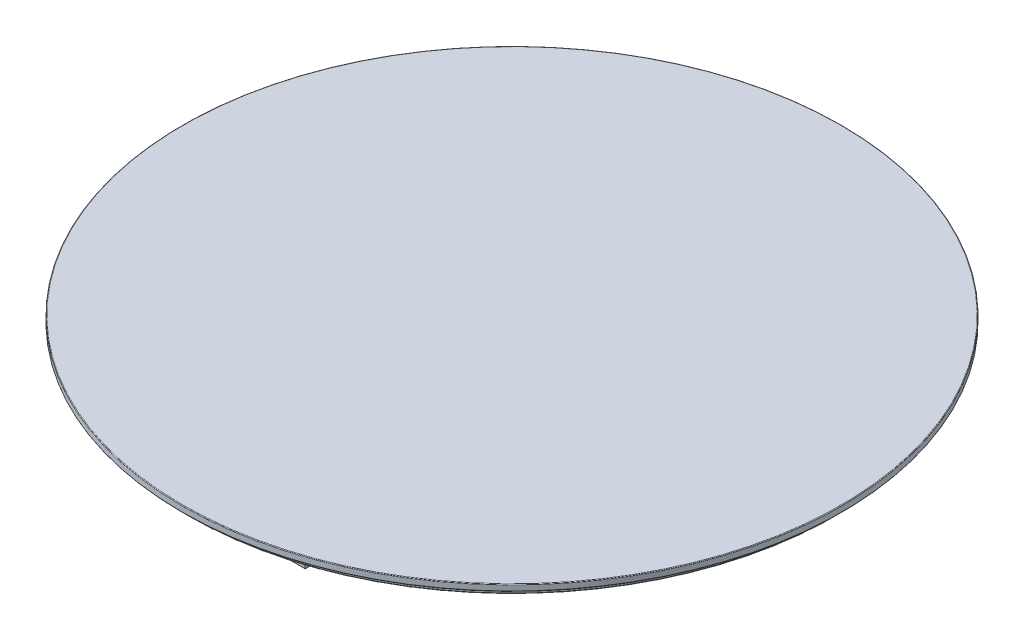
ISO-10303-21;
HEADER;
FILE_DESCRIPTION(('STEP AP214'),'2;1');
FILE_NAME('part.step','',(''),(''),'','','');
FILE_SCHEMA(('AUTOMOTIVE_DESIGN { 1 0 10303 214 1 1 1 1 }'));
ENDSEC;
DATA;
#1=APPLICATION_CONTEXT('core data for automotive mechanical design processes');
#2=APPLICATION_PROTOCOL_DEFINITION('international standard','automotive_design',2000,#1);
#3=PRODUCT_CONTEXT('',#1,'mechanical');
#4=PRODUCT('Part','Part','',(#3));
#5=PRODUCT_RELATED_PRODUCT_CATEGORY('part','',(#4));
#6=PRODUCT_DEFINITION_FORMATION('','',#4);
#7=PRODUCT_DEFINITION_CONTEXT('part definition',#1,'design');
#8=PRODUCT_DEFINITION('design','',#6,#7);
#9=PRODUCT_DEFINITION_SHAPE('','',#8);
#10=(LENGTH_UNIT() NAMED_UNIT(*) SI_UNIT(.MILLI.,.METRE.));
#11=(NAMED_UNIT(*) PLANE_ANGLE_UNIT() SI_UNIT($,.RADIAN.));
#12=(NAMED_UNIT(*) SI_UNIT($,.STERADIAN.) SOLID_ANGLE_UNIT());
#13=UNCERTAINTY_MEASURE_WITH_UNIT(LENGTH_MEASURE(1.E-05),#10,'distance_accuracy_value','');
#14=(GEOMETRIC_REPRESENTATION_CONTEXT(3) GLOBAL_UNCERTAINTY_ASSIGNED_CONTEXT((#13)) GLOBAL_UNIT_ASSIGNED_CONTEXT((#10,
#11,#12)) REPRESENTATION_CONTEXT('',''));
#15=CARTESIAN_POINT('',(0.,0.,0.));
#16=DIRECTION('',(0.,0.,1.));
#17=DIRECTION('',(1.,0.,0.));
#18=AXIS2_PLACEMENT_3D('',#15,#16,#17);
#19=CARTESIAN_POINT('',(0.,0.,0.));
#20=DIRECTION('',(0.,1.,0.));
#21=DIRECTION('',(0.,0.,1.));
#22=AXIS2_PLACEMENT_3D('',#19,#20,#21);
#23=PLANE('',#22);
#24=DIRECTION('',(-0.866025403784436,0.,-0.500000000000004));
#25=VECTOR('',#24,1.);
#26=CARTESIAN_POINT('',(-73.301270189222,0.,26.961524227066));
#27=LINE('',#26,#25);
#28=CARTESIAN_POINT('',(-73.301270189222,0.,26.961524227066));
#29=VERTEX_POINT('',#28);
#30=CARTESIAN_POINT('',(-220.525588832576,0.,-58.0384757729347));
#31=VERTEX_POINT('',#30);
#32=EDGE_CURVE('E334',#29,#31,#27,.T.);
#33=ORIENTED_EDGE('',*,*,#32,.F.);
#34=DIRECTION('',(-0.500000000000004,0.,0.866025403784437));
#35=VECTOR('',#34,1.);
#36=CARTESIAN_POINT('',(-13.3012701892216,0.,-76.9615242270664));
#37=LINE('',#36,#35);
#38=CARTESIAN_POINT('',(-13.3012701892216,0.,-76.9615242270664));
#39=VERTEX_POINT('',#38);
#40=EDGE_CURVE('E339',#39,#29,#37,.T.);
#41=ORIENTED_EDGE('',*,*,#40,.F.);
#42=DIRECTION('',(0.866025403784436,0.,0.500000000000004));
#43=VECTOR('',#42,1.);
#44=CARTESIAN_POINT('',(-13.3012701892216,0.,-76.9615242270664));
#45=LINE('',#44,#43);
#46=CARTESIAN_POINT('',(-160.525588832576,0.,-161.961524227067));
#47=VERTEX_POINT('',#46);
#48=EDGE_CURVE('E351',#47,#39,#45,.T.);
#49=ORIENTED_EDGE('',*,*,#48,.F.);
#50=DIRECTION('',(0.500000000000004,0.,-0.866025403784436));
#51=VECTOR('',#50,1.);
#52=CARTESIAN_POINT('',(-160.525588832576,0.,-161.961524227067));
#53=LINE('',#52,#51);
#54=EDGE_CURVE('E348',#31,#47,#53,.T.);
#55=ORIENTED_EDGE('',*,*,#54,.F.);
#56=EDGE_LOOP('',(#33,#41,#49,#55));
#57=FACE_BOUND('',#56,.T.);
#58=CARTESIAN_POINT('',(0.,0.,0.));
#59=DIRECTION('',(0.,1.,0.));
#60=DIRECTION('',(0.,0.,1.));
#61=AXIS2_PLACEMENT_3D('',#58,#59,#60);
#62=CIRCLE('',#61,249.5);
#63=CARTESIAN_POINT('',(0.,0.,249.5));
#64=VERTEX_POINT('',#63);
#65=EDGE_CURVE('E48',#64,#64,#62,.F.);
#66=ORIENTED_EDGE('',*,*,#65,.T.);
#67=EDGE_LOOP('',(#66));
#68=FACE_BOUND('',#67,.T.);
#69=DIRECTION('',(0.,0.,1.));
#70=VECTOR('',#69,1.);
#71=CARTESIAN_POINT('',(60.,0.,50.));
#72=LINE('',#71,#70);
#73=CARTESIAN_POINT('',(60.,0.,50.));
#74=VERTEX_POINT('',#73);
#75=CARTESIAN_POINT('',(60.,0.,220.));
#76=VERTEX_POINT('',#75);
#77=EDGE_CURVE('E367',#74,#76,#72,.T.);
#78=ORIENTED_EDGE('',*,*,#77,.F.);
#79=DIRECTION('',(1.,0.,0.));
#80=VECTOR('',#79,1.);
#81=CARTESIAN_POINT('',(-60.,0.,50.));
#82=LINE('',#81,#80);
#83=CARTESIAN_POINT('',(-60.,0.,50.));
#84=VERTEX_POINT('',#83);
#85=EDGE_CURVE('E372',#84,#74,#82,.T.);
#86=ORIENTED_EDGE('',*,*,#85,.F.);
#87=DIRECTION('',(0.,0.,-1.));
#88=VECTOR('',#87,1.);
#89=CARTESIAN_POINT('',(-60.,0.,50.));
#90=LINE('',#89,#88);
#91=CARTESIAN_POINT('',(-60.,0.,220.));
#92=VERTEX_POINT('',#91);
#93=EDGE_CURVE('E384',#92,#84,#90,.T.);
#94=ORIENTED_EDGE('',*,*,#93,.F.);
#95=DIRECTION('',(-1.,0.,0.));
#96=VECTOR('',#95,1.);
#97=CARTESIAN_POINT('',(-60.,0.,220.));
#98=LINE('',#97,#96);
#99=EDGE_CURVE('E381',#76,#92,#98,.T.);
#100=ORIENTED_EDGE('',*,*,#99,.F.);
#101=EDGE_LOOP('',(#78,#86,#94,#100));
#102=FACE_BOUND('',#101,.T.);
#103=DIRECTION('',(0.866025403784443,0.,-0.499999999999992));
#104=VECTOR('',#103,1.);
#105=CARTESIAN_POINT('',(13.3012701892226,0.,-76.9615242270662));
#106=LINE('',#105,#104);
#107=CARTESIAN_POINT('',(13.3012701892226,0.,-76.9615242270662));
#108=VERTEX_POINT('',#107);
#109=CARTESIAN_POINT('',(160.525588832578,0.,-161.961524227065));
#110=VERTEX_POINT('',#109);
#111=EDGE_CURVE('E295',#108,#110,#106,.T.);
#112=ORIENTED_EDGE('',*,*,#111,.F.);
#113=DIRECTION('',(-0.499999999999992,0.,-0.866025403784443));
#114=VECTOR('',#113,1.);
#115=CARTESIAN_POINT('',(73.3012701892217,0.,26.961524227067));
#116=LINE('',#115,#114);
#117=CARTESIAN_POINT('',(73.3012701892217,0.,26.961524227067));
#118=VERTEX_POINT('',#117);
#119=EDGE_CURVE('E306',#118,#108,#116,.T.);
#120=ORIENTED_EDGE('',*,*,#119,.F.);
#121=DIRECTION('',(-0.866025403784443,0.,0.499999999999992));
#122=VECTOR('',#121,1.);
#123=CARTESIAN_POINT('',(73.3012701892217,0.,26.961524227067));
#124=LINE('',#123,#122);
#125=CARTESIAN_POINT('',(220.525588832577,0.,-58.0384757729316));
#126=VERTEX_POINT('',#125);
#127=EDGE_CURVE('E318',#126,#118,#124,.T.);
#128=ORIENTED_EDGE('',*,*,#127,.F.);
#129=DIRECTION('',(0.499999999999992,0.,0.866025403784443));
#130=VECTOR('',#129,1.);
#131=CARTESIAN_POINT('',(220.525588832577,0.,-58.0384757729316));
#132=LINE('',#131,#130);
#133=EDGE_CURVE('E315',#110,#126,#132,.T.);
#134=ORIENTED_EDGE('',*,*,#133,.F.);
#135=EDGE_LOOP('',(#112,#120,#128,#134));
#136=FACE_BOUND('',#135,.T.);
#137=ADVANCED_FACE('F40',(#57,#68,#102,#136),#23,.F.);
#138=CARTESIAN_POINT('',(0.,10.,0.));
#139=DIRECTION('',(0.,-1.,0.));
#140=DIRECTION('',(0.,0.,-1.));
#141=AXIS2_PLACEMENT_3D('',#138,#139,#140);
#142=CYLINDRICAL_SURFACE('',#141,255.);
#143=CARTESIAN_POINT('',(0.,9.5,0.));
#144=DIRECTION('',(0.,1.,0.));
#145=DIRECTION('',(0.,0.,1.));
#146=AXIS2_PLACEMENT_3D('',#143,#144,#145);
#147=CIRCLE('',#146,255.);
#148=CARTESIAN_POINT('',(0.,9.5,255.));
#149=VERTEX_POINT('',#148);
#150=EDGE_CURVE('E409',#149,#149,#147,.F.);
#151=ORIENTED_EDGE('',*,*,#150,.T.);
#152=EDGE_LOOP('',(#151));
#153=FACE_BOUND('',#152,.T.);
#154=CARTESIAN_POINT('',(0.,5.5,0.));
#155=DIRECTION('',(0.,-1.,0.));
#156=DIRECTION('',(0.,0.,-1.));
#157=AXIS2_PLACEMENT_3D('',#154,#155,#156);
#158=CIRCLE('',#157,255.);
#159=CARTESIAN_POINT('',(0.,5.5,-255.));
#160=VERTEX_POINT('',#159);
#161=EDGE_CURVE('E406',#160,#160,#158,.F.);
#162=ORIENTED_EDGE('',*,*,#161,.T.);
#163=EDGE_LOOP('',(#162));
#164=FACE_BOUND('',#163,.T.);
#165=ADVANCED_FACE('F434',(#153,#164),#142,.T.);
#166=CARTESIAN_POINT('',(0.,10.,0.));
#167=DIRECTION('',(0.,1.,0.));
#168=DIRECTION('',(0.,0.,1.));
#169=AXIS2_PLACEMENT_3D('',#166,#167,#168);
#170=PLANE('',#169);
#171=CARTESIAN_POINT('',(0.,10.,0.));
#172=DIRECTION('',(0.,1.,0.));
#173=DIRECTION('',(0.,0.,1.));
#174=AXIS2_PLACEMENT_3D('',#171,#172,#173);
#175=CIRCLE('',#174,254.5);
#176=CARTESIAN_POINT('',(0.,10.,254.5));
#177=VERTEX_POINT('',#176);
#178=EDGE_CURVE('E403',#177,#177,#175,.T.);
#179=ORIENTED_EDGE('',*,*,#178,.T.);
#180=EDGE_LOOP('',(#179));
#181=FACE_BOUND('',#180,.T.);
#182=ADVANCED_FACE('F440',(#181),#170,.T.);
#183=CARTESIAN_POINT('',(0.,5.,0.));
#184=DIRECTION('',(0.,-1.,0.));
#185=DIRECTION('',(0.,0.,-1.));
#186=AXIS2_PLACEMENT_3D('',#183,#184,#185);
#187=CYLINDRICAL_SURFACE('',#186,250.);
#188=CARTESIAN_POINT('',(0.,0.5,0.));
#189=DIRECTION('',(0.,1.,0.));
#190=DIRECTION('',(0.,0.,1.));
#191=AXIS2_PLACEMENT_3D('',#188,#189,#190);
#192=CIRCLE('',#191,250.);
#193=CARTESIAN_POINT('',(0.,0.5,250.));
#194=VERTEX_POINT('',#193);
#195=EDGE_CURVE('E11',#194,#194,#192,.T.);
#196=ORIENTED_EDGE('',*,*,#195,.T.);
#197=EDGE_LOOP('',(#196));
#198=FACE_BOUND('',#197,.T.);
#199=CARTESIAN_POINT('',(0.,5.,0.));
#200=DIRECTION('',(0.,-1.,0.));
#201=DIRECTION('',(0.,0.,-1.));
#202=AXIS2_PLACEMENT_3D('',#199,#200,#201);
#203=CIRCLE('',#202,250.);
#204=CARTESIAN_POINT('',(0.,5.,-250.));
#205=VERTEX_POINT('',#204);
#206=EDGE_CURVE('E400',#205,#205,#203,.T.);
#207=ORIENTED_EDGE('',*,*,#206,.T.);
#208=EDGE_LOOP('',(#207));
#209=FACE_BOUND('',#208,.T.);
#210=ADVANCED_FACE('F452',(#198,#209),#187,.T.);
#211=CARTESIAN_POINT('',(0.,5.,0.));
#212=DIRECTION('',(0.,-1.,0.));
#213=DIRECTION('',(0.,0.,-1.));
#214=AXIS2_PLACEMENT_3D('',#211,#212,#213);
#215=PLANE('',#214);
#216=CARTESIAN_POINT('',(0.,5.,0.));
#217=DIRECTION('',(0.,-1.,0.));
#218=DIRECTION('',(0.,0.,-1.));
#219=AXIS2_PLACEMENT_3D('',#216,#217,#218);
#220=CIRCLE('',#219,254.5);
#221=CARTESIAN_POINT('',(0.,5.,-254.5));
#222=VERTEX_POINT('',#221);
#223=EDGE_CURVE('E412',#222,#222,#220,.T.);
#224=ORIENTED_EDGE('',*,*,#223,.T.);
#225=EDGE_LOOP('',(#224));
#226=FACE_BOUND('',#225,.T.);
#227=ORIENTED_EDGE('',*,*,#206,.F.);
#228=EDGE_LOOP('',(#227));
#229=FACE_BOUND('',#228,.T.);
#230=ADVANCED_FACE('F447',(#226,#229),#215,.T.);
#231=CARTESIAN_POINT('',(0.,9.5,0.));
#232=DIRECTION('',(0.,1.,0.));
#233=DIRECTION('',(0.,0.,1.));
#234=AXIS2_PLACEMENT_3D('',#231,#232,#233);
#235=TOROIDAL_SURFACE('',#234,254.5,0.5);
#236=ORIENTED_EDGE('',*,*,#150,.F.);
#237=EDGE_LOOP('',(#236));
#238=FACE_BOUND('',#237,.T.);
#239=ORIENTED_EDGE('',*,*,#178,.F.);
#240=EDGE_LOOP('',(#239));
#241=FACE_BOUND('',#240,.T.);
#242=ADVANCED_FACE('F430',(#238,#241),#235,.T.);
#243=CARTESIAN_POINT('',(0.,5.5,0.));
#244=DIRECTION('',(0.,-1.,0.));
#245=DIRECTION('',(0.,0.,-1.));
#246=AXIS2_PLACEMENT_3D('',#243,#244,#245);
#247=TOROIDAL_SURFACE('',#246,254.5,0.5);
#248=ORIENTED_EDGE('',*,*,#161,.F.);
#249=EDGE_LOOP('',(#248));
#250=FACE_BOUND('',#249,.T.);
#251=ORIENTED_EDGE('',*,*,#223,.F.);
#252=EDGE_LOOP('',(#251));
#253=FACE_BOUND('',#252,.T.);
#254=ADVANCED_FACE('F421',(#250,#253),#247,.T.);
#255=CARTESIAN_POINT('',(0.,0.5,0.));
#256=DIRECTION('',(0.,1.,0.));
#257=DIRECTION('',(0.,0.,1.));
#258=AXIS2_PLACEMENT_3D('',#255,#256,#257);
#259=TOROIDAL_SURFACE('',#258,249.5,0.5);
#260=ORIENTED_EDGE('',*,*,#195,.F.);
#261=EDGE_LOOP('',(#260));
#262=FACE_BOUND('',#261,.T.);
#263=ORIENTED_EDGE('',*,*,#65,.F.);
#264=EDGE_LOOP('',(#263));
#265=FACE_BOUND('',#264,.T.);
#266=ADVANCED_FACE('F42',(#262,#265),#259,.T.);
#267=CARTESIAN_POINT('',(60.,-20.,50.));
#268=DIRECTION('',(-1.,0.,0.));
#269=DIRECTION('',(0.,0.,1.));
#270=AXIS2_PLACEMENT_3D('',#267,#268,#269);
#271=PLANE('',#270);
#272=ORIENTED_EDGE('',*,*,#77,.T.);
#273=DIRECTION('',(0.,1.,0.));
#274=VECTOR('',#273,1.);
#275=CARTESIAN_POINT('',(60.,-20.,220.));
#276=LINE('',#275,#274);
#277=CARTESIAN_POINT('',(60.,-20.,220.));
#278=VERTEX_POINT('',#277);
#279=EDGE_CURVE('E397',#278,#76,#276,.T.);
#280=ORIENTED_EDGE('',*,*,#279,.F.);
#281=DIRECTION('',(0.,0.,1.));
#282=VECTOR('',#281,1.);
#283=CARTESIAN_POINT('',(60.,-20.,50.));
#284=LINE('',#283,#282);
#285=CARTESIAN_POINT('',(60.,-20.,50.));
#286=VERTEX_POINT('',#285);
#287=EDGE_CURVE('E368',#286,#278,#284,.T.);
#288=ORIENTED_EDGE('',*,*,#287,.F.);
#289=DIRECTION('',(0.,1.,0.));
#290=VECTOR('',#289,1.);
#291=CARTESIAN_POINT('',(60.,-20.,50.));
#292=LINE('',#291,#290);
#293=EDGE_CURVE('E378',#286,#74,#292,.T.);
#294=ORIENTED_EDGE('',*,*,#293,.T.);
#295=EDGE_LOOP('',(#272,#280,#288,#294));
#296=FACE_BOUND('',#295,.T.);
#297=ADVANCED_FACE('F420',(#296),#271,.F.);
#298=CARTESIAN_POINT('',(-60.,-20.,220.));
#299=DIRECTION('',(0.,0.,-1.));
#300=DIRECTION('',(-1.,0.,0.));
#301=AXIS2_PLACEMENT_3D('',#298,#299,#300);
#302=PLANE('',#301);
#303=ORIENTED_EDGE('',*,*,#99,.T.);
#304=DIRECTION('',(0.,1.,0.));
#305=VECTOR('',#304,1.);
#306=CARTESIAN_POINT('',(-60.,-20.,220.));
#307=LINE('',#306,#305);
#308=CARTESIAN_POINT('',(-60.,-20.,220.));
#309=VERTEX_POINT('',#308);
#310=EDGE_CURVE('E394',#309,#92,#307,.T.);
#311=ORIENTED_EDGE('',*,*,#310,.F.);
#312=DIRECTION('',(-1.,0.,0.));
#313=VECTOR('',#312,1.);
#314=CARTESIAN_POINT('',(-60.,-20.,220.));
#315=LINE('',#314,#313);
#316=EDGE_CURVE('E371',#278,#309,#315,.T.);
#317=ORIENTED_EDGE('',*,*,#316,.F.);
#318=ORIENTED_EDGE('',*,*,#279,.T.);
#319=EDGE_LOOP('',(#303,#311,#317,#318));
#320=FACE_BOUND('',#319,.T.);
#321=ADVANCED_FACE('F427',(#320),#302,.F.);
#322=CARTESIAN_POINT('',(-60.,-20.,50.));
#323=DIRECTION('',(1.,0.,0.));
#324=DIRECTION('',(0.,0.,-1.));
#325=AXIS2_PLACEMENT_3D('',#322,#323,#324);
#326=PLANE('',#325);
#327=ORIENTED_EDGE('',*,*,#93,.T.);
#328=DIRECTION('',(0.,1.,0.));
#329=VECTOR('',#328,1.);
#330=CARTESIAN_POINT('',(-60.,-20.,50.));
#331=LINE('',#330,#329);
#332=CARTESIAN_POINT('',(-60.,-20.,50.));
#333=VERTEX_POINT('',#332);
#334=EDGE_CURVE('E391',#333,#84,#331,.T.);
#335=ORIENTED_EDGE('',*,*,#334,.F.);
#336=DIRECTION('',(0.,0.,-1.));
#337=VECTOR('',#336,1.);
#338=CARTESIAN_POINT('',(-60.,-20.,50.));
#339=LINE('',#338,#337);
#340=EDGE_CURVE('E374',#309,#333,#339,.T.);
#341=ORIENTED_EDGE('',*,*,#340,.F.);
#342=ORIENTED_EDGE('',*,*,#310,.T.);
#343=EDGE_LOOP('',(#327,#335,#341,#342));
#344=FACE_BOUND('',#343,.T.);
#345=ADVANCED_FACE('F470',(#344),#326,.F.);
#346=CARTESIAN_POINT('',(-60.,-20.,50.));
#347=DIRECTION('',(0.,0.,1.));
#348=DIRECTION('',(1.,0.,0.));
#349=AXIS2_PLACEMENT_3D('',#346,#347,#348);
#350=PLANE('',#349);
#351=ORIENTED_EDGE('',*,*,#85,.T.);
#352=ORIENTED_EDGE('',*,*,#293,.F.);
#353=DIRECTION('',(1.,0.,0.));
#354=VECTOR('',#353,1.);
#355=CARTESIAN_POINT('',(-60.,-20.,50.));
#356=LINE('',#355,#354);
#357=EDGE_CURVE('E376',#333,#286,#356,.T.);
#358=ORIENTED_EDGE('',*,*,#357,.F.);
#359=ORIENTED_EDGE('',*,*,#334,.T.);
#360=EDGE_LOOP('',(#351,#352,#358,#359));
#361=FACE_BOUND('',#360,.T.);
#362=ADVANCED_FACE('F474',(#361),#350,.F.);
#363=CARTESIAN_POINT('',(0.,-20.,0.));
#364=DIRECTION('',(0.,1.,0.));
#365=DIRECTION('',(0.,0.,1.));
#366=AXIS2_PLACEMENT_3D('',#363,#364,#365);
#367=PLANE('',#366);
#368=DIRECTION('',(1.,0.,0.));
#369=VECTOR('',#368,1.);
#370=CARTESIAN_POINT('',(-55.,-20.,55.));
#371=LINE('',#370,#369);
#372=CARTESIAN_POINT('',(-55.,-20.,55.));
#373=VERTEX_POINT('',#372);
#374=CARTESIAN_POINT('',(55.,-20.,55.));
#375=VERTEX_POINT('',#374);
#376=EDGE_CURVE('E285',#373,#375,#371,.T.);
#377=ORIENTED_EDGE('',*,*,#376,.F.);
#378=DIRECTION('',(0.,0.,-1.));
#379=VECTOR('',#378,1.);
#380=CARTESIAN_POINT('',(-55.,-20.,215.));
#381=LINE('',#380,#379);
#382=CARTESIAN_POINT('',(-55.,-20.,215.));
#383=VERTEX_POINT('',#382);
#384=EDGE_CURVE('E237',#383,#373,#381,.T.);
#385=ORIENTED_EDGE('',*,*,#384,.F.);
#386=DIRECTION('',(-1.,0.,0.));
#387=VECTOR('',#386,1.);
#388=CARTESIAN_POINT('',(55.,-20.,215.));
#389=LINE('',#388,#387);
#390=CARTESIAN_POINT('',(55.,-20.,215.));
#391=VERTEX_POINT('',#390);
#392=EDGE_CURVE('E274',#391,#383,#389,.T.);
#393=ORIENTED_EDGE('',*,*,#392,.F.);
#394=DIRECTION('',(0.,0.,1.));
#395=VECTOR('',#394,1.);
#396=CARTESIAN_POINT('',(55.,-20.,55.));
#397=LINE('',#396,#395);
#398=EDGE_CURVE('E288',#375,#391,#397,.T.);
#399=ORIENTED_EDGE('',*,*,#398,.F.);
#400=EDGE_LOOP('',(#377,#385,#393,#399));
#401=FACE_BOUND('',#400,.T.);
#402=ORIENTED_EDGE('',*,*,#287,.T.);
#403=ORIENTED_EDGE('',*,*,#316,.T.);
#404=ORIENTED_EDGE('',*,*,#340,.T.);
#405=ORIENTED_EDGE('',*,*,#357,.T.);
#406=EDGE_LOOP('',(#402,#403,#404,#405));
#407=FACE_BOUND('',#406,.T.);
#408=ADVANCED_FACE('F478',(#401,#407),#367,.F.);
#409=CARTESIAN_POINT('',(-73.301270189222,-20.,26.961524227066));
#410=DIRECTION('',(0.500000000000004,0.,-0.866025403784436));
#411=DIRECTION('',(-0.866025403784436,0.,-0.500000000000004));
#412=AXIS2_PLACEMENT_3D('',#409,#410,#411);
#413=PLANE('',#412);
#414=ORIENTED_EDGE('',*,*,#32,.T.);
#415=DIRECTION('',(0.,1.,0.));
#416=VECTOR('',#415,1.);
#417=CARTESIAN_POINT('',(-220.525588832576,-20.,-58.0384757729348));
#418=LINE('',#417,#416);
#419=CARTESIAN_POINT('',(-220.525588832576,-20.,-58.0384757729348));
#420=VERTEX_POINT('',#419);
#421=EDGE_CURVE('E364',#420,#31,#418,.T.);
#422=ORIENTED_EDGE('',*,*,#421,.F.);
#423=DIRECTION('',(-0.866025403784436,0.,-0.500000000000004));
#424=VECTOR('',#423,1.);
#425=CARTESIAN_POINT('',(-73.301270189222,-20.,26.961524227066));
#426=LINE('',#425,#424);
#427=CARTESIAN_POINT('',(-73.301270189222,-20.,26.961524227066));
#428=VERTEX_POINT('',#427);
#429=EDGE_CURVE('E335',#428,#420,#426,.T.);
#430=ORIENTED_EDGE('',*,*,#429,.F.);
#431=DIRECTION('',(0.,1.,0.));
#432=VECTOR('',#431,1.);
#433=CARTESIAN_POINT('',(-73.301270189222,-20.,26.961524227066));
#434=LINE('',#433,#432);
#435=EDGE_CURVE('E345',#428,#29,#434,.T.);
#436=ORIENTED_EDGE('',*,*,#435,.T.);
#437=EDGE_LOOP('',(#414,#422,#430,#436));
#438=FACE_BOUND('',#437,.T.);
#439=ADVANCED_FACE('F482',(#438),#413,.F.);
#440=CARTESIAN_POINT('',(-160.525588832576,-20.,-161.961524227067));
#441=DIRECTION('',(0.866025403784436,0.,0.500000000000004));
#442=DIRECTION('',(0.500000000000004,0.,-0.866025403784436));
#443=AXIS2_PLACEMENT_3D('',#440,#441,#442);
#444=PLANE('',#443);
#445=ORIENTED_EDGE('',*,*,#54,.T.);
#446=DIRECTION('',(0.,1.,0.));
#447=VECTOR('',#446,1.);
#448=CARTESIAN_POINT('',(-160.525588832576,-20.,-161.961524227067));
#449=LINE('',#448,#447);
#450=CARTESIAN_POINT('',(-160.525588832576,-20.,-161.961524227067));
#451=VERTEX_POINT('',#450);
#452=EDGE_CURVE('E361',#451,#47,#449,.T.);
#453=ORIENTED_EDGE('',*,*,#452,.F.);
#454=DIRECTION('',(0.500000000000004,0.,-0.866025403784436));
#455=VECTOR('',#454,1.);
#456=CARTESIAN_POINT('',(-160.525588832576,-20.,-161.961524227067));
#457=LINE('',#456,#455);
#458=EDGE_CURVE('E338',#420,#451,#457,.T.);
#459=ORIENTED_EDGE('',*,*,#458,.F.);
#460=ORIENTED_EDGE('',*,*,#421,.T.);
#461=EDGE_LOOP('',(#445,#453,#459,#460));
#462=FACE_BOUND('',#461,.T.);
#463=ADVANCED_FACE('F486',(#462),#444,.F.);
#464=CARTESIAN_POINT('',(-13.3012701892216,-20.,-76.9615242270664));
#465=DIRECTION('',(-0.500000000000004,0.,0.866025403784436));
#466=DIRECTION('',(0.866025403784436,0.,0.500000000000004));
#467=AXIS2_PLACEMENT_3D('',#464,#465,#466);
#468=PLANE('',#467);
#469=ORIENTED_EDGE('',*,*,#48,.T.);
#470=DIRECTION('',(0.,1.,0.));
#471=VECTOR('',#470,1.);
#472=CARTESIAN_POINT('',(-13.3012701892216,-20.,-76.9615242270664));
#473=LINE('',#472,#471);
#474=CARTESIAN_POINT('',(-13.3012701892216,-20.,-76.9615242270664));
#475=VERTEX_POINT('',#474);
#476=EDGE_CURVE('E358',#475,#39,#473,.T.);
#477=ORIENTED_EDGE('',*,*,#476,.F.);
#478=DIRECTION('',(0.866025403784436,0.,0.500000000000004));
#479=VECTOR('',#478,1.);
#480=CARTESIAN_POINT('',(-13.3012701892216,-20.,-76.9615242270664));
#481=LINE('',#480,#479);
#482=EDGE_CURVE('E341',#451,#475,#481,.T.);
#483=ORIENTED_EDGE('',*,*,#482,.F.);
#484=ORIENTED_EDGE('',*,*,#452,.T.);
#485=EDGE_LOOP('',(#469,#477,#483,#484));
#486=FACE_BOUND('',#485,.T.);
#487=ADVANCED_FACE('F490',(#486),#468,.F.);
#488=CARTESIAN_POINT('',(-13.3012701892216,-20.,-76.9615242270664));
#489=DIRECTION('',(-0.866025403784436,0.,-0.500000000000004));
#490=DIRECTION('',(-0.500000000000004,0.,0.866025403784436));
#491=AXIS2_PLACEMENT_3D('',#488,#489,#490);
#492=PLANE('',#491);
#493=ORIENTED_EDGE('',*,*,#40,.T.);
#494=ORIENTED_EDGE('',*,*,#435,.F.);
#495=DIRECTION('',(-0.500000000000004,0.,0.866025403784437));
#496=VECTOR('',#495,1.);
#497=CARTESIAN_POINT('',(-13.3012701892216,-20.,-76.9615242270664));
#498=LINE('',#497,#496);
#499=EDGE_CURVE('E343',#475,#428,#498,.T.);
#500=ORIENTED_EDGE('',*,*,#499,.F.);
#501=ORIENTED_EDGE('',*,*,#476,.T.);
#502=EDGE_LOOP('',(#493,#494,#500,#501));
#503=FACE_BOUND('',#502,.T.);
#504=ADVANCED_FACE('F494',(#503),#492,.F.);
#505=CARTESIAN_POINT('',(0.,-20.,0.));
#506=DIRECTION('',(0.,1.,0.));
#507=DIRECTION('',(-0.866025403784436,0.,-0.500000000000004));
#508=AXIS2_PLACEMENT_3D('',#505,#506,#507);
#509=PLANE('',#508);
#510=DIRECTION('',(-0.499999999999992,0.,0.866025403784443));
#511=VECTOR('',#510,1.);
#512=CARTESIAN_POINT('',(-20.1313972081448,-20.,-75.131397208144));
#513=LINE('',#512,#511);
#514=CARTESIAN_POINT('',(-20.1313972081448,-20.,-75.131397208144));
#515=VERTEX_POINT('',#514);
#516=CARTESIAN_POINT('',(-75.1313972081439,-20.,20.1313972081448));
#517=VERTEX_POINT('',#516);
#518=EDGE_CURVE('E256',#515,#517,#513,.T.);
#519=ORIENTED_EDGE('',*,*,#518,.F.);
#520=DIRECTION('',(0.866025403784443,0.,0.499999999999992));
#521=VECTOR('',#520,1.);
#522=CARTESIAN_POINT('',(-158.695461813656,-20.,-155.131397208143));
#523=LINE('',#522,#521);
#524=CARTESIAN_POINT('',(-158.695461813656,-20.,-155.131397208143));
#525=VERTEX_POINT('',#524);
#526=EDGE_CURVE('E55',#525,#515,#523,.T.);
#527=ORIENTED_EDGE('',*,*,#526,.F.);
#528=DIRECTION('',(0.499999999999992,0.,-0.866025403784443));
#529=VECTOR('',#528,1.);
#530=CARTESIAN_POINT('',(-213.695461813655,-20.,-59.8686027918539));
#531=LINE('',#530,#529);
#532=CARTESIAN_POINT('',(-213.695461813655,-20.,-59.8686027918539));
#533=VERTEX_POINT('',#532);
#534=EDGE_CURVE('E245',#533,#525,#531,.T.);
#535=ORIENTED_EDGE('',*,*,#534,.F.);
#536=DIRECTION('',(-0.866025403784443,0.,-0.499999999999992));
#537=VECTOR('',#536,1.);
#538=CARTESIAN_POINT('',(-75.1313972081439,-20.,20.1313972081448));
#539=LINE('',#538,#537);
#540=EDGE_CURVE('E259',#517,#533,#539,.T.);
#541=ORIENTED_EDGE('',*,*,#540,.F.);
#542=EDGE_LOOP('',(#519,#527,#535,#541));
#543=FACE_BOUND('',#542,.T.);
#544=ORIENTED_EDGE('',*,*,#429,.T.);
#545=ORIENTED_EDGE('',*,*,#458,.T.);
#546=ORIENTED_EDGE('',*,*,#482,.T.);
#547=ORIENTED_EDGE('',*,*,#499,.T.);
#548=EDGE_LOOP('',(#544,#545,#546,#547));
#549=FACE_BOUND('',#548,.T.);
#550=ADVANCED_FACE('F498',(#543,#549),#509,.F.);
#551=CARTESIAN_POINT('',(13.3012701892226,-20.,-76.9615242270662));
#552=DIRECTION('',(0.499999999999992,0.,0.866025403784443));
#553=DIRECTION('',(0.866025403784443,0.,-0.499999999999992));
#554=AXIS2_PLACEMENT_3D('',#551,#552,#553);
#555=PLANE('',#554);
#556=ORIENTED_EDGE('',*,*,#111,.T.);
#557=DIRECTION('',(0.,1.,0.));
#558=VECTOR('',#557,1.);
#559=CARTESIAN_POINT('',(160.525588832578,-20.,-161.961524227065));
#560=LINE('',#559,#558);
#561=CARTESIAN_POINT('',(160.525588832578,-20.,-161.961524227065));
#562=VERTEX_POINT('',#561);
#563=EDGE_CURVE('E331',#562,#110,#560,.T.);
#564=ORIENTED_EDGE('',*,*,#563,.F.);
#565=DIRECTION('',(0.866025403784443,0.,-0.499999999999992));
#566=VECTOR('',#565,1.);
#567=CARTESIAN_POINT('',(13.3012701892226,-20.,-76.9615242270662));
#568=LINE('',#567,#566);
#569=CARTESIAN_POINT('',(13.3012701892226,-20.,-76.9615242270662));
#570=VERTEX_POINT('',#569);
#571=EDGE_CURVE('E302',#570,#562,#568,.T.);
#572=ORIENTED_EDGE('',*,*,#571,.F.);
#573=DIRECTION('',(0.,1.,0.));
#574=VECTOR('',#573,1.);
#575=CARTESIAN_POINT('',(13.3012701892226,-20.,-76.9615242270662));
#576=LINE('',#575,#574);
#577=EDGE_CURVE('E312',#570,#108,#576,.T.);
#578=ORIENTED_EDGE('',*,*,#577,.T.);
#579=EDGE_LOOP('',(#556,#564,#572,#578));
#580=FACE_BOUND('',#579,.T.);
#581=ADVANCED_FACE('F502',(#580),#555,.F.);
#582=CARTESIAN_POINT('',(220.525588832577,-20.,-58.0384757729316));
#583=DIRECTION('',(-0.866025403784443,0.,0.499999999999992));
#584=DIRECTION('',(0.499999999999992,0.,0.866025403784443));
#585=AXIS2_PLACEMENT_3D('',#582,#583,#584);
#586=PLANE('',#585);
#587=ORIENTED_EDGE('',*,*,#133,.T.);
#588=DIRECTION('',(0.,1.,0.));
#589=VECTOR('',#588,1.);
#590=CARTESIAN_POINT('',(220.525588832577,-20.,-58.0384757729316));
#591=LINE('',#590,#589);
#592=CARTESIAN_POINT('',(220.525588832577,-20.,-58.0384757729316));
#593=VERTEX_POINT('',#592);
#594=EDGE_CURVE('E328',#593,#126,#591,.T.);
#595=ORIENTED_EDGE('',*,*,#594,.F.);
#596=DIRECTION('',(0.499999999999992,0.,0.866025403784443));
#597=VECTOR('',#596,1.);
#598=CARTESIAN_POINT('',(220.525588832577,-20.,-58.0384757729316));
#599=LINE('',#598,#597);
#600=EDGE_CURVE('E305',#562,#593,#599,.T.);
#601=ORIENTED_EDGE('',*,*,#600,.F.);
#602=ORIENTED_EDGE('',*,*,#563,.T.);
#603=EDGE_LOOP('',(#587,#595,#601,#602));
#604=FACE_BOUND('',#603,.T.);
#605=ADVANCED_FACE('F506',(#604),#586,.F.);
#606=CARTESIAN_POINT('',(73.3012701892217,-20.,26.961524227067));
#607=DIRECTION('',(-0.499999999999992,0.,-0.866025403784443));
#608=DIRECTION('',(-0.866025403784443,0.,0.499999999999992));
#609=AXIS2_PLACEMENT_3D('',#606,#607,#608);
#610=PLANE('',#609);
#611=ORIENTED_EDGE('',*,*,#127,.T.);
#612=DIRECTION('',(0.,1.,0.));
#613=VECTOR('',#612,1.);
#614=CARTESIAN_POINT('',(73.3012701892217,-20.,26.961524227067));
#615=LINE('',#614,#613);
#616=CARTESIAN_POINT('',(73.3012701892217,-20.,26.961524227067));
#617=VERTEX_POINT('',#616);
#618=EDGE_CURVE('E325',#617,#118,#615,.T.);
#619=ORIENTED_EDGE('',*,*,#618,.F.);
#620=DIRECTION('',(-0.866025403784443,0.,0.499999999999992));
#621=VECTOR('',#620,1.);
#622=CARTESIAN_POINT('',(73.3012701892217,-20.,26.961524227067));
#623=LINE('',#622,#621);
#624=EDGE_CURVE('E308',#593,#617,#623,.T.);
#625=ORIENTED_EDGE('',*,*,#624,.F.);
#626=ORIENTED_EDGE('',*,*,#594,.T.);
#627=EDGE_LOOP('',(#611,#619,#625,#626));
#628=FACE_BOUND('',#627,.T.);
#629=ADVANCED_FACE('F510',(#628),#610,.F.);
#630=CARTESIAN_POINT('',(73.3012701892217,-20.,26.961524227067));
#631=DIRECTION('',(0.866025403784443,0.,-0.499999999999992));
#632=DIRECTION('',(-0.499999999999992,0.,-0.866025403784443));
#633=AXIS2_PLACEMENT_3D('',#630,#631,#632);
#634=PLANE('',#633);
#635=ORIENTED_EDGE('',*,*,#119,.T.);
#636=ORIENTED_EDGE('',*,*,#577,.F.);
#637=DIRECTION('',(-0.499999999999992,0.,-0.866025403784443));
#638=VECTOR('',#637,1.);
#639=CARTESIAN_POINT('',(73.3012701892217,-20.,26.961524227067));
#640=LINE('',#639,#638);
#641=EDGE_CURVE('E310',#617,#570,#640,.T.);
#642=ORIENTED_EDGE('',*,*,#641,.F.);
#643=ORIENTED_EDGE('',*,*,#618,.T.);
#644=EDGE_LOOP('',(#635,#636,#642,#643));
#645=FACE_BOUND('',#644,.T.);
#646=ADVANCED_FACE('F514',(#645),#634,.F.);
#647=CARTESIAN_POINT('',(0.,-20.,0.));
#648=DIRECTION('',(0.,1.,0.));
#649=DIRECTION('',(0.866025403784443,0.,-0.499999999999992));
#650=AXIS2_PLACEMENT_3D('',#647,#648,#649);
#651=PLANE('',#650);
#652=DIRECTION('',(-0.500000000000004,0.,-0.866025403784436));
#653=VECTOR('',#652,1.);
#654=CARTESIAN_POINT('',(75.1313972081442,-20.,20.1313972081438));
#655=LINE('',#654,#653);
#656=CARTESIAN_POINT('',(75.1313972081442,-20.,20.1313972081438));
#657=VERTEX_POINT('',#656);
#658=CARTESIAN_POINT('',(20.1313972081438,-20.,-75.1313972081442));
#659=VERTEX_POINT('',#658);
#660=EDGE_CURVE('E230',#657,#659,#655,.T.);
#661=ORIENTED_EDGE('',*,*,#660,.F.);
#662=DIRECTION('',(-0.866025403784436,0.,0.500000000000004));
#663=VECTOR('',#662,1.);
#664=CARTESIAN_POINT('',(213.695461813654,-20.,-59.8686027918568));
#665=LINE('',#664,#663);
#666=CARTESIAN_POINT('',(213.695461813654,-20.,-59.8686027918568));
#667=VERTEX_POINT('',#666);
#668=EDGE_CURVE('E63',#667,#657,#665,.T.);
#669=ORIENTED_EDGE('',*,*,#668,.F.);
#670=DIRECTION('',(0.500000000000004,0.,0.866025403784436));
#671=VECTOR('',#670,1.);
#672=CARTESIAN_POINT('',(158.695461813654,-20.,-155.131397208145));
#673=LINE('',#672,#671);
#674=CARTESIAN_POINT('',(158.695461813654,-20.,-155.131397208145));
#675=VERTEX_POINT('',#674);
#676=EDGE_CURVE('E221',#675,#667,#673,.T.);
#677=ORIENTED_EDGE('',*,*,#676,.F.);
#678=DIRECTION('',(0.866025403784436,0.,-0.500000000000004));
#679=VECTOR('',#678,1.);
#680=CARTESIAN_POINT('',(20.1313972081438,-20.,-75.1313972081442));
#681=LINE('',#680,#679);
#682=EDGE_CURVE('E224',#659,#675,#681,.T.);
#683=ORIENTED_EDGE('',*,*,#682,.F.);
#684=EDGE_LOOP('',(#661,#669,#677,#683));
#685=FACE_BOUND('',#684,.T.);
#686=ORIENTED_EDGE('',*,*,#571,.T.);
#687=ORIENTED_EDGE('',*,*,#600,.T.);
#688=ORIENTED_EDGE('',*,*,#624,.T.);
#689=ORIENTED_EDGE('',*,*,#641,.T.);
#690=EDGE_LOOP('',(#686,#687,#688,#689));
#691=FACE_BOUND('',#690,.T.);
#692=ADVANCED_FACE('F518',(#685,#691),#651,.F.);
#693=CARTESIAN_POINT('',(-55.,0.,215.));
#694=DIRECTION('',(-1.,0.,0.));
#695=DIRECTION('',(0.,0.,1.));
#696=AXIS2_PLACEMENT_3D('',#693,#694,#695);
#697=PLANE('',#696);
#698=ORIENTED_EDGE('',*,*,#384,.T.);
#699=DIRECTION('',(0.,-1.,0.));
#700=VECTOR('',#699,1.);
#701=CARTESIAN_POINT('',(-55.,0.,55.));
#702=LINE('',#701,#700);
#703=CARTESIAN_POINT('',(-55.,0.,55.));
#704=VERTEX_POINT('',#703);
#705=EDGE_CURVE('E283',#704,#373,#702,.T.);
#706=ORIENTED_EDGE('',*,*,#705,.F.);
#707=DIRECTION('',(0.,0.,-1.));
#708=VECTOR('',#707,1.);
#709=CARTESIAN_POINT('',(-55.,0.,215.));
#710=LINE('',#709,#708);
#711=CARTESIAN_POINT('',(-55.,0.,215.));
#712=VERTEX_POINT('',#711);
#713=EDGE_CURVE('E270',#712,#704,#710,.T.);
#714=ORIENTED_EDGE('',*,*,#713,.F.);
#715=DIRECTION('',(0.,-1.,0.));
#716=VECTOR('',#715,1.);
#717=CARTESIAN_POINT('',(-55.,0.,215.));
#718=LINE('',#717,#716);
#719=EDGE_CURVE('E293',#712,#383,#718,.T.);
#720=ORIENTED_EDGE('',*,*,#719,.T.);
#721=EDGE_LOOP('',(#698,#706,#714,#720));
#722=FACE_BOUND('',#721,.T.);
#723=ADVANCED_FACE('F522',(#722),#697,.F.);
#724=CARTESIAN_POINT('',(55.,0.,215.));
#725=DIRECTION('',(0.,0.,1.));
#726=DIRECTION('',(1.,0.,0.));
#727=AXIS2_PLACEMENT_3D('',#724,#725,#726);
#728=PLANE('',#727);
#729=ORIENTED_EDGE('',*,*,#392,.T.);
#730=ORIENTED_EDGE('',*,*,#719,.F.);
#731=DIRECTION('',(-1.,0.,0.));
#732=VECTOR('',#731,1.);
#733=CARTESIAN_POINT('',(55.,0.,215.));
#734=LINE('',#733,#732);
#735=CARTESIAN_POINT('',(55.,0.,215.));
#736=VERTEX_POINT('',#735);
#737=EDGE_CURVE('E280',#736,#712,#734,.T.);
#738=ORIENTED_EDGE('',*,*,#737,.F.);
#739=DIRECTION('',(0.,-1.,0.));
#740=VECTOR('',#739,1.);
#741=CARTESIAN_POINT('',(55.,0.,215.));
#742=LINE('',#741,#740);
#743=EDGE_CURVE('E296',#736,#391,#742,.T.);
#744=ORIENTED_EDGE('',*,*,#743,.T.);
#745=EDGE_LOOP('',(#729,#730,#738,#744));
#746=FACE_BOUND('',#745,.T.);
#747=ADVANCED_FACE('F526',(#746),#728,.F.);
#748=CARTESIAN_POINT('',(55.,0.,55.));
#749=DIRECTION('',(1.,0.,0.));
#750=DIRECTION('',(0.,0.,-1.));
#751=AXIS2_PLACEMENT_3D('',#748,#749,#750);
#752=PLANE('',#751);
#753=ORIENTED_EDGE('',*,*,#398,.T.);
#754=ORIENTED_EDGE('',*,*,#743,.F.);
#755=DIRECTION('',(0.,0.,1.));
#756=VECTOR('',#755,1.);
#757=CARTESIAN_POINT('',(55.,0.,55.));
#758=LINE('',#757,#756);
#759=CARTESIAN_POINT('',(55.,0.,55.));
#760=VERTEX_POINT('',#759);
#761=EDGE_CURVE('E277',#760,#736,#758,.T.);
#762=ORIENTED_EDGE('',*,*,#761,.F.);
#763=DIRECTION('',(0.,-1.,0.));
#764=VECTOR('',#763,1.);
#765=CARTESIAN_POINT('',(55.,0.,55.));
#766=LINE('',#765,#764);
#767=EDGE_CURVE('E298',#760,#375,#766,.T.);
#768=ORIENTED_EDGE('',*,*,#767,.T.);
#769=EDGE_LOOP('',(#753,#754,#762,#768));
#770=FACE_BOUND('',#769,.T.);
#771=ADVANCED_FACE('F532',(#770),#752,.F.);
#772=CARTESIAN_POINT('',(-55.,0.,55.));
#773=DIRECTION('',(0.,0.,-1.));
#774=DIRECTION('',(-1.,0.,0.));
#775=AXIS2_PLACEMENT_3D('',#772,#773,#774);
#776=PLANE('',#775);
#777=ORIENTED_EDGE('',*,*,#376,.T.);
#778=ORIENTED_EDGE('',*,*,#767,.F.);
#779=DIRECTION('',(1.,0.,0.));
#780=VECTOR('',#779,1.);
#781=CARTESIAN_POINT('',(-55.,0.,55.));
#782=LINE('',#781,#780);
#783=EDGE_CURVE('E273',#704,#760,#782,.T.);
#784=ORIENTED_EDGE('',*,*,#783,.F.);
#785=ORIENTED_EDGE('',*,*,#705,.T.);
#786=EDGE_LOOP('',(#777,#778,#784,#785));
#787=FACE_BOUND('',#786,.T.);
#788=ADVANCED_FACE('F528',(#787),#776,.F.);
#789=CARTESIAN_POINT('',(0.,0.,0.));
#790=DIRECTION('',(0.,-1.,0.));
#791=DIRECTION('',(0.,0.,-1.));
#792=AXIS2_PLACEMENT_3D('',#789,#790,#791);
#793=PLANE('',#792);
#794=ORIENTED_EDGE('',*,*,#713,.T.);
#795=ORIENTED_EDGE('',*,*,#783,.T.);
#796=ORIENTED_EDGE('',*,*,#761,.T.);
#797=ORIENTED_EDGE('',*,*,#737,.T.);
#798=EDGE_LOOP('',(#794,#795,#796,#797));
#799=FACE_BOUND('',#798,.T.);
#800=ADVANCED_FACE('F531',(#799),#793,.T.);
#801=CARTESIAN_POINT('',(213.695461813654,0.,-59.8686027918568));
#802=DIRECTION('',(0.500000000000004,0.,0.866025403784436));
#803=DIRECTION('',(0.866025403784436,0.,-0.500000000000004));
#804=AXIS2_PLACEMENT_3D('',#801,#802,#803);
#805=PLANE('',#804);
#806=ORIENTED_EDGE('',*,*,#668,.T.);
#807=DIRECTION('',(0.,-1.,0.));
#808=VECTOR('',#807,1.);
#809=CARTESIAN_POINT('',(75.1313972081442,0.,20.1313972081438));
#810=LINE('',#809,#808);
#811=CARTESIAN_POINT('',(75.1313972081442,0.,20.1313972081438));
#812=VERTEX_POINT('',#811);
#813=EDGE_CURVE('E199',#812,#657,#810,.T.);
#814=ORIENTED_EDGE('',*,*,#813,.F.);
#815=DIRECTION('',(-0.866025403784436,0.,0.500000000000004));
#816=VECTOR('',#815,1.);
#817=CARTESIAN_POINT('',(213.695461813654,0.,-59.8686027918568));
#818=LINE('',#817,#816);
#819=CARTESIAN_POINT('',(213.695461813654,0.,-59.8686027918568));
#820=VERTEX_POINT('',#819);
#821=EDGE_CURVE('E203',#820,#812,#818,.T.);
#822=ORIENTED_EDGE('',*,*,#821,.F.);
#823=DIRECTION('',(0.,-1.,0.));
#824=VECTOR('',#823,1.);
#825=CARTESIAN_POINT('',(213.695461813654,0.,-59.8686027918568));
#826=LINE('',#825,#824);
#827=EDGE_CURVE('E235',#820,#667,#826,.T.);
#828=ORIENTED_EDGE('',*,*,#827,.T.);
#829=EDGE_LOOP('',(#806,#814,#822,#828));
#830=FACE_BOUND('',#829,.T.);
#831=ADVANCED_FACE('F201',(#830),#805,.F.);
#832=CARTESIAN_POINT('',(158.695461813654,0.,-155.131397208145));
#833=DIRECTION('',(0.866025403784436,0.,-0.500000000000004));
#834=DIRECTION('',(-0.500000000000004,0.,-0.866025403784436));
#835=AXIS2_PLACEMENT_3D('',#832,#833,#834);
#836=PLANE('',#835);
#837=ORIENTED_EDGE('',*,*,#676,.T.);
#838=ORIENTED_EDGE('',*,*,#827,.F.);
#839=DIRECTION('',(0.500000000000004,0.,0.866025403784436));
#840=VECTOR('',#839,1.);
#841=CARTESIAN_POINT('',(158.695461813654,0.,-155.131397208145));
#842=LINE('',#841,#840);
#843=CARTESIAN_POINT('',(158.695461813654,0.,-155.131397208145));
#844=VERTEX_POINT('',#843);
#845=EDGE_CURVE('E209',#844,#820,#842,.T.);
#846=ORIENTED_EDGE('',*,*,#845,.F.);
#847=DIRECTION('',(0.,-1.,0.));
#848=VECTOR('',#847,1.);
#849=CARTESIAN_POINT('',(158.695461813654,0.,-155.131397208145));
#850=LINE('',#849,#848);
#851=EDGE_CURVE('E238',#844,#675,#850,.T.);
#852=ORIENTED_EDGE('',*,*,#851,.T.);
#853=EDGE_LOOP('',(#837,#838,#846,#852));
#854=FACE_BOUND('',#853,.T.);
#855=ADVANCED_FACE('F564',(#854),#836,.F.);
#856=CARTESIAN_POINT('',(20.1313972081438,0.,-75.1313972081442));
#857=DIRECTION('',(-0.500000000000004,0.,-0.866025403784436));
#858=DIRECTION('',(-0.866025403784436,0.,0.500000000000004));
#859=AXIS2_PLACEMENT_3D('',#856,#857,#858);
#860=PLANE('',#859);
#861=ORIENTED_EDGE('',*,*,#682,.T.);
#862=ORIENTED_EDGE('',*,*,#851,.F.);
#863=DIRECTION('',(0.866025403784436,0.,-0.500000000000004));
#864=VECTOR('',#863,1.);
#865=CARTESIAN_POINT('',(20.1313972081438,0.,-75.1313972081442));
#866=LINE('',#865,#864);
#867=CARTESIAN_POINT('',(20.1313972081438,0.,-75.1313972081442));
#868=VERTEX_POINT('',#867);
#869=EDGE_CURVE('E217',#868,#844,#866,.T.);
#870=ORIENTED_EDGE('',*,*,#869,.F.);
#871=DIRECTION('',(0.,-1.,0.));
#872=VECTOR('',#871,1.);
#873=CARTESIAN_POINT('',(20.1313972081438,0.,-75.1313972081442));
#874=LINE('',#873,#872);
#875=EDGE_CURVE('E208',#868,#659,#874,.T.);
#876=ORIENTED_EDGE('',*,*,#875,.T.);
#877=EDGE_LOOP('',(#861,#862,#870,#876));
#878=FACE_BOUND('',#877,.T.);
#879=ADVANCED_FACE('F567',(#878),#860,.F.);
#880=CARTESIAN_POINT('',(75.1313972081442,0.,20.1313972081438));
#881=DIRECTION('',(-0.866025403784436,0.,0.500000000000004));
#882=DIRECTION('',(0.500000000000004,0.,0.866025403784436));
#883=AXIS2_PLACEMENT_3D('',#880,#881,#882);
#884=PLANE('',#883);
#885=ORIENTED_EDGE('',*,*,#660,.T.);
#886=ORIENTED_EDGE('',*,*,#875,.F.);
#887=DIRECTION('',(-0.500000000000004,0.,-0.866025403784436));
#888=VECTOR('',#887,1.);
#889=CARTESIAN_POINT('',(75.1313972081442,0.,20.1313972081438));
#890=LINE('',#889,#888);
#891=EDGE_CURVE('E212',#812,#868,#890,.T.);
#892=ORIENTED_EDGE('',*,*,#891,.F.);
#893=ORIENTED_EDGE('',*,*,#813,.T.);
#894=EDGE_LOOP('',(#885,#886,#892,#893));
#895=FACE_BOUND('',#894,.T.);
#896=ADVANCED_FACE('F213',(#895),#884,.F.);
#897=CARTESIAN_POINT('',(0.,0.,0.));
#898=DIRECTION('',(0.,-1.,0.));
#899=DIRECTION('',(-0.866025403784436,0.,0.500000000000004));
#900=AXIS2_PLACEMENT_3D('',#897,#898,#899);
#901=PLANE('',#900);
#902=ORIENTED_EDGE('',*,*,#821,.T.);
#903=ORIENTED_EDGE('',*,*,#891,.T.);
#904=ORIENTED_EDGE('',*,*,#869,.T.);
#905=ORIENTED_EDGE('',*,*,#845,.T.);
#906=EDGE_LOOP('',(#902,#903,#904,#905));
#907=FACE_BOUND('',#906,.T.);
#908=ADVANCED_FACE('F219',(#907),#901,.T.);
#909=CARTESIAN_POINT('',(-158.695461813656,0.,-155.131397208143));
#910=DIRECTION('',(0.499999999999992,0.,-0.866025403784443));
#911=DIRECTION('',(-0.866025403784443,0.,-0.499999999999992));
#912=AXIS2_PLACEMENT_3D('',#909,#910,#911);
#913=PLANE('',#912);
#914=ORIENTED_EDGE('',*,*,#526,.T.);
#915=DIRECTION('',(0.,-1.,0.));
#916=VECTOR('',#915,1.);
#917=CARTESIAN_POINT('',(-20.1313972081448,0.,-75.131397208144));
#918=LINE('',#917,#916);
#919=CARTESIAN_POINT('',(-20.1313972081448,0.,-75.131397208144));
#920=VERTEX_POINT('',#919);
#921=EDGE_CURVE('E254',#920,#515,#918,.T.);
#922=ORIENTED_EDGE('',*,*,#921,.F.);
#923=DIRECTION('',(0.866025403784443,0.,0.499999999999992));
#924=VECTOR('',#923,1.);
#925=CARTESIAN_POINT('',(-158.695461813656,0.,-155.131397208143));
#926=LINE('',#925,#924);
#927=CARTESIAN_POINT('',(-158.695461813656,0.,-155.131397208143));
#928=VERTEX_POINT('',#927);
#929=EDGE_CURVE('E241',#928,#920,#926,.T.);
#930=ORIENTED_EDGE('',*,*,#929,.F.);
#931=DIRECTION('',(0.,-1.,0.));
#932=VECTOR('',#931,1.);
#933=CARTESIAN_POINT('',(-158.695461813656,0.,-155.131397208143));
#934=LINE('',#933,#932);
#935=EDGE_CURVE('E231',#928,#525,#934,.T.);
#936=ORIENTED_EDGE('',*,*,#935,.T.);
#937=EDGE_LOOP('',(#914,#922,#930,#936));
#938=FACE_BOUND('',#937,.T.);
#939=ADVANCED_FACE('F543',(#938),#913,.F.);
#940=CARTESIAN_POINT('',(-213.695461813655,0.,-59.8686027918539));
#941=DIRECTION('',(-0.866025403784443,0.,-0.499999999999992));
#942=DIRECTION('',(-0.499999999999992,0.,0.866025403784443));
#943=AXIS2_PLACEMENT_3D('',#940,#941,#942);
#944=PLANE('',#943);
#945=ORIENTED_EDGE('',*,*,#534,.T.);
#946=ORIENTED_EDGE('',*,*,#935,.F.);
#947=DIRECTION('',(0.499999999999992,0.,-0.866025403784443));
#948=VECTOR('',#947,1.);
#949=CARTESIAN_POINT('',(-213.695461813655,0.,-59.8686027918539));
#950=LINE('',#949,#948);
#951=CARTESIAN_POINT('',(-213.695461813655,0.,-59.8686027918539));
#952=VERTEX_POINT('',#951);
#953=EDGE_CURVE('E251',#952,#928,#950,.T.);
#954=ORIENTED_EDGE('',*,*,#953,.F.);
#955=DIRECTION('',(0.,-1.,0.));
#956=VECTOR('',#955,1.);
#957=CARTESIAN_POINT('',(-213.695461813655,0.,-59.8686027918539));
#958=LINE('',#957,#956);
#959=EDGE_CURVE('E265',#952,#533,#958,.T.);
#960=ORIENTED_EDGE('',*,*,#959,.T.);
#961=EDGE_LOOP('',(#945,#946,#954,#960));
#962=FACE_BOUND('',#961,.T.);
#963=ADVANCED_FACE('F546',(#962),#944,.F.);
#964=CARTESIAN_POINT('',(-75.1313972081439,0.,20.1313972081448));
#965=DIRECTION('',(-0.499999999999992,0.,0.866025403784443));
#966=DIRECTION('',(0.866025403784443,0.,0.499999999999992));
#967=AXIS2_PLACEMENT_3D('',#964,#965,#966);
#968=PLANE('',#967);
#969=ORIENTED_EDGE('',*,*,#540,.T.);
#970=ORIENTED_EDGE('',*,*,#959,.F.);
#971=DIRECTION('',(-0.866025403784443,0.,-0.499999999999992));
#972=VECTOR('',#971,1.);
#973=CARTESIAN_POINT('',(-75.1313972081439,0.,20.1313972081448));
#974=LINE('',#973,#972);
#975=CARTESIAN_POINT('',(-75.1313972081439,0.,20.1313972081448));
#976=VERTEX_POINT('',#975);
#977=EDGE_CURVE('E248',#976,#952,#974,.T.);
#978=ORIENTED_EDGE('',*,*,#977,.F.);
#979=DIRECTION('',(0.,-1.,0.));
#980=VECTOR('',#979,1.);
#981=CARTESIAN_POINT('',(-75.1313972081439,0.,20.1313972081448));
#982=LINE('',#981,#980);
#983=EDGE_CURVE('E267',#976,#517,#982,.T.);
#984=ORIENTED_EDGE('',*,*,#983,.T.);
#985=EDGE_LOOP('',(#969,#970,#978,#984));
#986=FACE_BOUND('',#985,.T.);
#987=ADVANCED_FACE('F551',(#986),#968,.F.);
#988=CARTESIAN_POINT('',(-20.1313972081448,0.,-75.131397208144));
#989=DIRECTION('',(0.866025403784443,0.,0.499999999999992));
#990=DIRECTION('',(0.499999999999992,0.,-0.866025403784443));
#991=AXIS2_PLACEMENT_3D('',#988,#989,#990);
#992=PLANE('',#991);
#993=ORIENTED_EDGE('',*,*,#518,.T.);
#994=ORIENTED_EDGE('',*,*,#983,.F.);
#995=DIRECTION('',(-0.499999999999992,0.,0.866025403784443));
#996=VECTOR('',#995,1.);
#997=CARTESIAN_POINT('',(-20.1313972081448,0.,-75.131397208144));
#998=LINE('',#997,#996);
#999=EDGE_CURVE('E244',#920,#976,#998,.T.);
#1000=ORIENTED_EDGE('',*,*,#999,.F.);
#1001=ORIENTED_EDGE('',*,*,#921,.T.);
#1002=EDGE_LOOP('',(#993,#994,#1000,#1001));
#1003=FACE_BOUND('',#1002,.T.);
#1004=ADVANCED_FACE('F547',(#1003),#992,.F.);
#1005=CARTESIAN_POINT('',(0.,0.,0.));
#1006=DIRECTION('',(0.,-1.,0.));
#1007=DIRECTION('',(0.866025403784443,0.,0.499999999999992));
#1008=AXIS2_PLACEMENT_3D('',#1005,#1006,#1007);
#1009=PLANE('',#1008);
#1010=ORIENTED_EDGE('',*,*,#929,.T.);
#1011=ORIENTED_EDGE('',*,*,#999,.T.);
#1012=ORIENTED_EDGE('',*,*,#977,.T.);
#1013=ORIENTED_EDGE('',*,*,#953,.T.);
#1014=EDGE_LOOP('',(#1010,#1011,#1012,#1013));
#1015=FACE_BOUND('',#1014,.T.);
#1016=ADVANCED_FACE('F550',(#1015),#1009,.T.);
#1017=CLOSED_SHELL('',(#137,#165,#182,#210,#230,#242,#254,#266,#297,#321,#345,#362,#408,#439,
#463,#487,#504,#550,#581,#605,#629,#646,#692,#723,#747,#771,#788,#800,#831,#855,#879,#896,#908,
#939,#963,#987,#1004,#1016));
#1018=MANIFOLD_SOLID_BREP('B2',#1017);
#1019=ADVANCED_BREP_SHAPE_REPRESENTATION('',(#18,#1018),#14);
#1020=SHAPE_DEFINITION_REPRESENTATION(#9,#1019);
ENDSEC;
END-ISO-10303-21;
